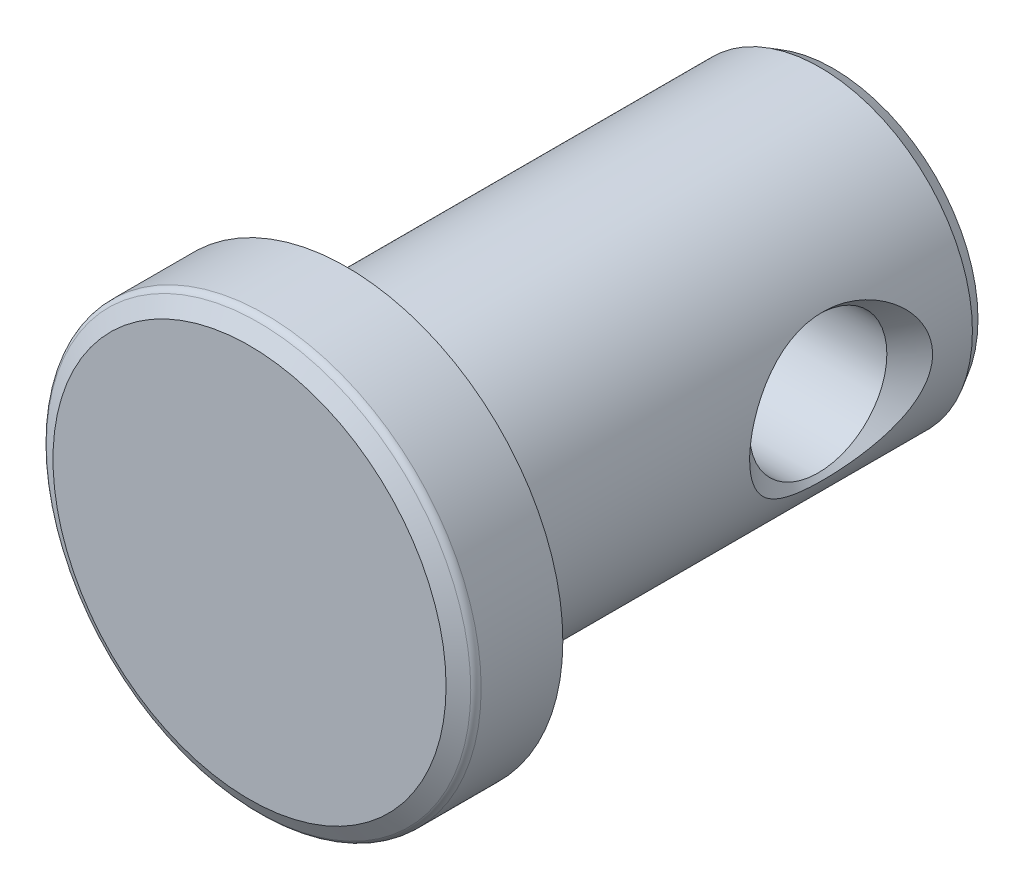
ISO-10303-21;
HEADER;
FILE_DESCRIPTION(('STEP AP214'),'2;1');
FILE_NAME('part.step','',(''),(''),'','','');
FILE_SCHEMA(('AUTOMOTIVE_DESIGN { 1 0 10303 214 1 1 1 1 }'));
ENDSEC;
DATA;
#1=APPLICATION_CONTEXT('core data for automotive mechanical design processes');
#2=APPLICATION_PROTOCOL_DEFINITION('international standard','automotive_design',2000,#1);
#3=PRODUCT_CONTEXT('',#1,'mechanical');
#4=PRODUCT('Part','Part','',(#3));
#5=PRODUCT_RELATED_PRODUCT_CATEGORY('part','',(#4));
#6=PRODUCT_DEFINITION_FORMATION('','',#4);
#7=PRODUCT_DEFINITION_CONTEXT('part definition',#1,'design');
#8=PRODUCT_DEFINITION('design','',#6,#7);
#9=PRODUCT_DEFINITION_SHAPE('','',#8);
#10=(LENGTH_UNIT() NAMED_UNIT(*) SI_UNIT(.MILLI.,.METRE.));
#11=(NAMED_UNIT(*) PLANE_ANGLE_UNIT() SI_UNIT($,.RADIAN.));
#12=(NAMED_UNIT(*) SI_UNIT($,.STERADIAN.) SOLID_ANGLE_UNIT());
#13=UNCERTAINTY_MEASURE_WITH_UNIT(LENGTH_MEASURE(1.E-05),#10,'distance_accuracy_value','');
#14=(GEOMETRIC_REPRESENTATION_CONTEXT(3) GLOBAL_UNCERTAINTY_ASSIGNED_CONTEXT((#13)) GLOBAL_UNIT_ASSIGNED_CONTEXT((#10,
#11,#12)) REPRESENTATION_CONTEXT('',''));
#15=CARTESIAN_POINT('',(0.,0.,0.));
#16=DIRECTION('',(0.,0.,1.));
#17=DIRECTION('',(1.,0.,0.));
#18=AXIS2_PLACEMENT_3D('',#15,#16,#17);
#19=CARTESIAN_POINT('',(0.,0.,6.35));
#20=DIRECTION('',(0.,0.,1.));
#21=DIRECTION('',(1.,0.,0.));
#22=AXIS2_PLACEMENT_3D('',#19,#20,#21);
#23=CYLINDRICAL_SURFACE('',#22,3.9751);
#24=CARTESIAN_POINT('',(-3.82643748007835,-1.07694058647979,-4.54101522611289));
#25=CARTESIAN_POINT('',(-3.80340961947426,-1.15876229377878,-4.46985763651813));
#26=CARTESIAN_POINT('',(-3.77924982220282,-1.23455494734904,-4.39214167255414));
#27=CARTESIAN_POINT('',(-3.73083058634614,-1.37396423330214,-4.2265068648053));
#28=CARTESIAN_POINT('',(-3.70657107264391,-1.43756870113621,-4.13857796698778));
#29=CARTESIAN_POINT('',(-3.65611377151084,-1.56187327261285,-3.94000708346451));
#30=CARTESIAN_POINT('',(-3.63022464718491,-1.6204894192179,-3.82797989187618));
#31=CARTESIAN_POINT('',(-3.58344381554274,-1.72146619822226,-3.59585667697558));
#32=CARTESIAN_POINT('',(-3.56255386847473,-1.76382110807973,-3.47575783058139));
#33=CARTESIAN_POINT('',(-3.52545249984078,-1.83699610693502,-3.21212639610093));
#34=CARTESIAN_POINT('',(-3.51035398229165,-1.86526354719489,-3.067716031371));
#35=CARTESIAN_POINT('',(-3.49182350781219,-1.89973186224367,-2.77557720375863));
#36=CARTESIAN_POINT('',(-3.48838915937021,-1.90593726043862,-2.62784942730033));
#37=CARTESIAN_POINT('',(-3.49369191069717,-1.89619688184882,-2.33433224729264));
#38=CARTESIAN_POINT('',(-3.50234862535577,-1.88039740224467,-2.18853648574035));
#39=CARTESIAN_POINT('',(-3.53038747985248,-1.82720328940694,-1.90191259663654));
#40=CARTESIAN_POINT('',(-3.54977790043675,-1.78979198229619,-1.76108839383946));
#41=CARTESIAN_POINT('',(-3.59669944051289,-1.69353138139375,-1.48747125278432));
#42=CARTESIAN_POINT('',(-3.62427772747663,-1.63455740380095,-1.35473037125108));
#43=CARTESIAN_POINT('',(-3.68390978716511,-1.49531085275908,-1.10199491184463));
#44=CARTESIAN_POINT('',(-3.71596018907952,-1.41505428019492,-0.981990852568222));
#45=CARTESIAN_POINT('',(-3.77233140052246,-1.25547689567154,-0.786890652837697));
#46=CARTESIAN_POINT('',(-3.79661697013559,-1.18076905357289,-0.708004340496707));
#47=CARTESIAN_POINT('',(-3.8431294909839,-1.01922052225169,-0.563095025191479));
#48=CARTESIAN_POINT('',(-3.86535983047798,-0.932400416567153,-0.497050645198684));
#49=CARTESIAN_POINT('',(-3.90131029308091,-0.766093451593039,-0.393118408672082));
#50=CARTESIAN_POINT('',(-3.91584251594878,-0.688660562085003,-0.352238203404533));
#51=CARTESIAN_POINT('',(-3.94075962661656,-0.527679374496886,-0.283130479101266));
#52=CARTESIAN_POINT('',(-3.95114741884406,-0.444135407834027,-0.254894097537709));
#53=CARTESIAN_POINT('',(-3.96670094592032,-0.272354268328005,-0.212888961585174));
#54=CARTESIAN_POINT('',(-3.97183134469941,-0.184089480007816,-0.199218081009173));
#55=CARTESIAN_POINT('',(-3.97608633148908,-0.00639586015051778,-0.187866855724356));
#56=CARTESIAN_POINT('',(-3.97521329979005,0.0830324960097191,-0.190180173468535));
#57=CARTESIAN_POINT('',(-3.96800286001554,0.250256652605567,-0.209456839335923));
#58=CARTESIAN_POINT('',(-3.96226187383386,0.328270954369364,-0.224821490487522));
#59=CARTESIAN_POINT('',(-3.94667715793361,0.4806563809819,-0.26706555649697));
#60=CARTESIAN_POINT('',(-3.93683274527504,0.555026897085799,-0.293946888115548));
#61=CARTESIAN_POINT('',(-3.91327764465712,0.702535242968325,-0.35945265842862));
#62=CARTESIAN_POINT('',(-3.89938994104233,0.775399620719499,-0.39862320346026));
#63=CARTESIAN_POINT('',(-3.86909322225121,0.914674163840125,-0.486307876107147));
#64=CARTESIAN_POINT('',(-3.85268233627979,0.981079480049124,-0.534828943418643));
#65=CARTESIAN_POINT('',(-3.80968402924804,1.13904414823776,-0.666224514279943));
#66=CARTESIAN_POINT('',(-3.78215967310927,1.22626000569189,-0.754034344225825));
#67=CARTESIAN_POINT('',(-3.72699391232398,1.38492603821817,-0.942889013720701));
#68=CARTESIAN_POINT('',(-3.69935238621976,1.45634759767613,-1.04395735547205));
#69=CARTESIAN_POINT('',(-3.64631401314617,1.5845184514708,-1.25784338731287));
#70=CARTESIAN_POINT('',(-3.62096067173673,1.64101191978833,-1.37082458867957));
#71=CARTESIAN_POINT('',(-3.57554046887568,1.73775285056882,-1.60445357637367));
#72=CARTESIAN_POINT('',(-3.55547175436556,1.77800601035027,-1.72509865688767));
#73=CARTESIAN_POINT('',(-3.5202472467638,1.84689659854725,-1.99025493558214));
#74=CARTESIAN_POINT('',(-3.50628344322534,1.87287837600224,-2.13562757490295));
#75=CARTESIAN_POINT('',(-3.49023678890882,1.90261956217379,-2.42927537313586));
#76=CARTESIAN_POINT('',(-3.48815382245512,1.90637918725235,-2.57755050377427));
#77=CARTESIAN_POINT('',(-3.49614396821527,1.89168144847368,-2.87103181037196));
#78=CARTESIAN_POINT('',(-3.50608504287703,1.87346540790825,-3.01625382423986));
#79=CARTESIAN_POINT('',(-3.53641936121992,1.81554689362808,-3.30131545716483));
#80=CARTESIAN_POINT('',(-3.55682100653891,1.77582714730289,-3.44115065247029));
#81=CARTESIAN_POINT('',(-3.60546884322506,1.67486615890086,-3.71284772091401));
#82=CARTESIAN_POINT('',(-3.63378469265293,1.61343246573858,-3.84462551033357));
#83=CARTESIAN_POINT('',(-3.6944615504342,1.46917796358799,-4.09491193423229));
#84=CARTESIAN_POINT('',(-3.72681879870057,1.38637695922043,-4.21343271113145));
#85=CARTESIAN_POINT('',(-3.78276020391457,1.22371455640988,-4.4035960703516));
#86=CARTESIAN_POINT('',(-3.80642837700849,1.14873410986262,-4.47939723846152));
#87=CARTESIAN_POINT('',(-3.85149023928349,0.987141025034064,-4.61819805207427));
#88=CARTESIAN_POINT('',(-3.87288767007469,0.900548071587092,-4.68121891747546));
#89=CARTESIAN_POINT('',(-3.9073735740855,0.734551844113735,-4.78024534129163));
#90=CARTESIAN_POINT('',(-3.92126865942386,0.657037192891857,-4.81912232439663));
#91=CARTESIAN_POINT('',(-3.94483977324634,0.496226954330582,-4.88421745292665));
#92=CARTESIAN_POINT('',(-3.9545187241145,0.412935417768241,-4.91044436801469));
#93=CARTESIAN_POINT('',(-3.96865077049351,0.242095361545105,-4.9485259265936));
#94=CARTESIAN_POINT('',(-3.97307117704795,0.154523700640545,-4.96029068314645));
#95=CARTESIAN_POINT('',(-3.97601444073262,-0.0214151421057132,-4.96813894274884));
#96=CARTESIAN_POINT('',(-3.97453915166233,-0.109782065172633,-4.96422737494629));
#97=CARTESIAN_POINT('',(-3.96632677463884,-0.275444037937247,-4.9422518395939));
#98=CARTESIAN_POINT('',(-3.9601281273731,-0.352965548905855,-4.92563552989368));
#99=CARTESIAN_POINT('',(-3.94372702321409,-0.504212263444769,-4.88108242354218));
#100=CARTESIAN_POINT('',(-3.93352353023946,-0.577936479040682,-4.85314269738358));
#101=CARTESIAN_POINT('',(-3.90883352518545,-0.727117191703546,-4.78425277840521));
#102=CARTESIAN_POINT('',(-3.89402948647434,-0.802058445299214,-4.74230978279803));
#103=CARTESIAN_POINT('',(-3.86186275164993,-0.944886215995423,-4.64859895133175));
#104=CARTESIAN_POINT('',(-3.84449825905446,-1.01276772229663,-4.59682420985824));
#105=CARTESIAN_POINT('',(-3.82643748007835,-1.07694058647979,-4.54101522611289));
#106=B_SPLINE_CURVE_WITH_KNOTS('',3,(#24,#25,#26,#27,#28,#29,#30,#31,#32,#33,#34,#35,#36,#37,
#38,#39,#40,#41,#42,#43,#44,#45,#46,#47,#48,#49,#50,#51,#52,#53,#54,#55,#56,#57,#58,#59,#60,#61,
#62,#63,#64,#65,#66,#67,#68,#69,#70,#71,#72,#73,#74,#75,#76,#77,#78,#79,#80,#81,#82,#83,#84,#85,
#86,#87,#88,#89,#90,#91,#92,#93,#94,#95,#96,#97,#98,#99,#100,#101,#102,#103,#104,#105),
.UNSPECIFIED.,.T.,.F.,(4,2,2,2,2,2,2,2,2,2,2,2,2,2,2,2,2,2,2,2,2,2,2,2,2,2,2,2,2,2,2,2,2,2,2,2,
2,2,2,2,4),(0.,0.332288609355063,0.664907155001696,1.05061559531827,1.43645964733271,
1.87808227832972,2.31961435770361,2.75822492820166,3.19717434670393,3.6387031554409,
4.07990094628751,4.41272029859722,4.74498079660189,5.01021244094966,5.27525788240613,
5.54207329335618,5.80878292119986,6.04687258425486,6.28500188879432,6.53573147043712,
6.78664785825178,7.1649403169657,7.54391263886069,7.92901073331096,8.31397361245758,
8.75680426906086,9.19963061411564,9.6376380583614,10.0759978502983,10.5183444963066,
10.960282609976,11.28679041272,11.61275157465,11.8751759058495,12.1374180488944,
12.4012820016402,12.6650629934597,12.9025841984267,13.1401668923219,13.4005976489773,
13.6612120079497),.UNSPECIFIED.);
#107=CARTESIAN_POINT('',(-3.82643748007835,-1.07694058647979,-4.54101522611289));
#108=VERTEX_POINT('',#107);
#109=EDGE_CURVE('E63',#108,#108,#106,.T.);
#110=ORIENTED_EDGE('',*,*,#109,.F.);
#111=EDGE_LOOP('',(#110));
#112=FACE_BOUND('',#111,.T.);
#113=CARTESIAN_POINT('',(0.,0.,6.151245));
#114=DIRECTION('',(0.,0.,1.));
#115=DIRECTION('',(1.,0.,0.));
#116=AXIS2_PLACEMENT_3D('',#113,#114,#115);
#117=CIRCLE('',#116,3.9751);
#118=CARTESIAN_POINT('',(3.9751,0.,6.151245));
#119=VERTEX_POINT('',#118);
#120=EDGE_CURVE('E10',#119,#119,#117,.F.);
#121=ORIENTED_EDGE('',*,*,#120,.T.);
#122=EDGE_LOOP('',(#121));
#123=FACE_BOUND('',#122,.T.);
#124=CARTESIAN_POINT('',(0.,0.,-6.00574624174165));
#125=DIRECTION('',(0.,0.,1.));
#126=DIRECTION('',(1.,0.,0.));
#127=AXIS2_PLACEMENT_3D('',#124,#125,#126);
#128=CIRCLE('',#127,3.9751);
#129=CARTESIAN_POINT('',(3.9751,0.,-6.00574624174165));
#130=VERTEX_POINT('',#129);
#131=EDGE_CURVE('E133',#130,#130,#128,.T.);
#132=ORIENTED_EDGE('',*,*,#131,.T.);
#133=EDGE_LOOP('',(#132));
#134=FACE_BOUND('',#133,.T.);
#135=CARTESIAN_POINT('',(3.82643748007835,-1.07694058647979,-4.54101522611289));
#136=CARTESIAN_POINT('',(3.84966792311604,-0.99440229208386,-4.61279693939063));
#137=CARTESIAN_POINT('',(3.87176292481149,-0.905679227861297,-4.6779548800937));
#138=CARTESIAN_POINT('',(3.91110686969781,-0.716855249500103,-4.79099901345332));
#139=CARTESIAN_POINT('',(3.92836579770212,-0.616778386632106,-4.83892085160481));
#140=CARTESIAN_POINT('',(3.95178079698464,-0.436687927586181,-4.90307403078027));
#141=CARTESIAN_POINT('',(3.95968408792754,-0.358706711078792,-4.92439332559249));
#142=CARTESIAN_POINT('',(3.97085747517787,-0.200033469722788,-4.95441029871307));
#143=CARTESIAN_POINT('',(3.97413121173905,-0.11934362585873,-4.96311789382712));
#144=CARTESIAN_POINT('',(3.97569800256795,0.0425613000951286,-4.96729392835765));
#145=CARTESIAN_POINT('',(3.9739828685157,0.123777027136292,-4.96274060237877));
#146=CARTESIAN_POINT('',(3.96574346165495,0.284176216900789,-4.94068923783323));
#147=CARTESIAN_POINT('',(3.95921762349804,0.363359009449831,-4.92318698582654));
#148=CARTESIAN_POINT('',(3.94212553444231,0.516673387978603,-4.8767037337254));
#149=CARTESIAN_POINT('',(3.93161066093703,0.590855633896852,-4.84786853477699));
#150=CARTESIAN_POINT('',(3.90742849736417,0.733963270181326,-4.78025679480489));
#151=CARTESIAN_POINT('',(3.89375935191725,0.802885534688285,-4.74147440122309));
#152=CARTESIAN_POINT('',(3.85775492734112,0.963631009212244,-4.63669714796614));
#153=CARTESIAN_POINT('',(3.83424501977873,1.05227617743545,-4.56622093548527));
#154=CARTESIAN_POINT('',(3.78536456110421,1.21647457635251,-4.41193203004635));
#155=CARTESIAN_POINT('',(3.75999088680149,1.29200508360222,-4.32809666249079));
#156=CARTESIAN_POINT('',(3.70929316207401,1.43113234005928,-4.14855534964358));
#157=CARTESIAN_POINT('',(3.68397814432446,1.49449105387407,-4.05266364918946));
#158=CARTESIAN_POINT('',(3.63601824724863,1.60765866327857,-3.85265661323267));
#159=CARTESIAN_POINT('',(3.61337313044373,1.65746876448729,-3.74854201050693));
#160=CARTESIAN_POINT('',(3.56816700612962,1.75299733105398,-3.51044085633461));
#161=CARTESIAN_POINT('',(3.54671198252009,1.79542694873316,-3.37490811992171));
#162=CARTESIAN_POINT('',(3.513394081947,1.8597860959744,-3.09790371565666));
#163=CARTESIAN_POINT('',(3.50153316797288,1.88171143042932,-2.95643083865575));
#164=CARTESIAN_POINT('',(3.48889348731604,1.90505719211959,-2.66655023079077));
#165=CARTESIAN_POINT('',(3.48849448263482,1.90577498153622,-2.51806794471271));
#166=CARTESIAN_POINT('',(3.49981980698862,1.88489031949944,-2.22313512097934));
#167=CARTESIAN_POINT('',(3.51154689086273,1.86328279611918,-2.07668505267065));
#168=CARTESIAN_POINT('',(3.54508825050516,1.79862672403138,-1.79207043318239));
#169=CARTESIAN_POINT('',(3.5667561076003,1.75588872167393,-1.65381743568775));
#170=CARTESIAN_POINT('',(3.61719598833598,1.64947650402412,-1.38691935452522));
#171=CARTESIAN_POINT('',(3.64596934612587,1.58579835620397,-1.25827608112202));
#172=CARTESIAN_POINT('',(3.70263423314711,1.44798382463688,-1.03165287272444));
#173=CARTESIAN_POINT('',(3.73008247742864,1.37657065136719,-0.931903572528899));
#174=CARTESIAN_POINT('',(3.78476459438619,1.21818436444045,-0.745572648906542));
#175=CARTESIAN_POINT('',(3.81199874181534,1.13123658320537,-0.658970006137853));
#176=CARTESIAN_POINT('',(3.85706477563672,0.9643982470532,-0.521588800993405));
#177=CARTESIAN_POINT('',(3.87559781810622,0.887694113522051,-0.467180562123118));
#178=CARTESIAN_POINT('',(3.90911514316354,0.725973813424707,-0.370972491846265));
#179=CARTESIAN_POINT('',(3.92410162427104,0.64096284271073,-0.32916484488912));
#180=CARTESIAN_POINT('',(3.94903226449832,0.463321167170744,-0.260524506467626));
#181=CARTESIAN_POINT('',(3.95892617709467,0.370624632558129,-0.233840786479761));
#182=CARTESIAN_POINT('',(3.97208493011195,0.181410667006507,-0.198494402877559));
#183=CARTESIAN_POINT('',(3.97535747034346,0.0848978073370287,-0.189810807128779));
#184=CARTESIAN_POINT('',(3.97485066657185,-0.0933361990769903,-0.191167047524396));
#185=CARTESIAN_POINT('',(3.97206064180393,-0.175092428659985,-0.198580024884294));
#186=CARTESIAN_POINT('',(3.96169208608739,-0.336031522745038,-0.226396049783184));
#187=CARTESIAN_POINT('',(3.95411314756973,-0.41521416761444,-0.246800202960458));
#188=CARTESIAN_POINT('',(3.93505153396014,-0.568026058534567,-0.298913029917217));
#189=CARTESIAN_POINT('',(3.92362144096272,-0.641714586334988,-0.330469701603308));
#190=CARTESIAN_POINT('',(3.89778372354388,-0.783522693643917,-0.403312446244958));
#191=CARTESIAN_POINT('',(3.88337437302623,-0.851639012702237,-0.444604161359247));
#192=CARTESIAN_POINT('',(3.84542580141675,-1.01176744224294,-0.556345831737027));
#193=CARTESIAN_POINT('',(3.8207453755669,-1.10026914093284,-0.631450831591305));
#194=CARTESIAN_POINT('',(3.76993727563568,-1.26346033452261,-0.794998992018738));
#195=CARTESIAN_POINT('',(3.74380710243741,-1.33812495068993,-0.883465668213834));
#196=CARTESIAN_POINT('',(3.69211718075989,-1.47482930078812,-1.07230190294325));
#197=CARTESIAN_POINT('',(3.66657590810428,-1.53662021548904,-1.17285555467236));
#198=CARTESIAN_POINT('',(3.61881501109556,-1.64595094552866,-1.38208430610331));
#199=CARTESIAN_POINT('',(3.59659490653518,-1.69349282213511,-1.49075822828144));
#200=CARTESIAN_POINT('',(3.55346589023506,-1.78248224290073,-1.73690415796679));
#201=CARTESIAN_POINT('',(3.53373428171762,-1.82074463772932,-1.87575054734208));
#202=CARTESIAN_POINT('',(3.50462788114469,-1.87616462620741,-2.15865219210237));
#203=CARTESIAN_POINT('',(3.49525376919499,-1.89332083396667,-2.30270778889901));
#204=CARTESIAN_POINT('',(3.48818761772552,-1.90631425940913,-2.59463913526066));
#205=CARTESIAN_POINT('',(3.49070488011025,-1.9017694999882,-2.74253741359349));
#206=CARTESIAN_POINT('',(3.50752040109506,-1.87056703528968,-3.03537686961425));
#207=CARTESIAN_POINT('',(3.52182639000917,-1.84389482012459,-3.18031604297848));
#208=CARTESIAN_POINT('',(3.55992817851203,-1.76919702351371,-3.46191875215952));
#209=CARTESIAN_POINT('',(3.58364403451047,-1.72135094406691,-3.59864110708028));
#210=CARTESIAN_POINT('',(3.63737140473296,-1.60470018102084,-3.86138720138379));
#211=CARTESIAN_POINT('',(3.66737456070273,-1.53592326824118,-3.98742483554681));
#212=CARTESIAN_POINT('',(3.71969695331867,-1.40306088383026,-4.18638026085495));
#213=CARTESIAN_POINT('',(3.74136353993957,-1.34465029836385,-4.26329583367242));
#214=CARTESIAN_POINT('',(3.78446198107245,-1.21808852354618,-4.40887521863913));
#215=CARTESIAN_POINT('',(3.80589372682619,-1.14993301073846,-4.47753534313337));
#216=CARTESIAN_POINT('',(3.82643748007835,-1.07694058647979,-4.54101522611289));
#217=B_SPLINE_CURVE_WITH_KNOTS('',3,(#135,#136,#137,#138,#139,#140,#141,#142,#143,#144,#145,
#146,#147,#148,#149,#150,#151,#152,#153,#154,#155,#156,#157,#158,#159,#160,#161,#162,#163,#164,
#165,#166,#167,#168,#169,#170,#171,#172,#173,#174,#175,#176,#177,#178,#179,#180,#181,#182,#183,
#184,#185,#186,#187,#188,#189,#190,#191,#192,#193,#194,#195,#196,#197,#198,#199,#200,#201,#202,
#203,#204,#205,#206,#207,#208,#209,#210,#211,#212,#213,#214,#215,#216),.UNSPECIFIED.,.T.,.F.,(4,
2,2,2,2,2,2,2,2,2,2,2,2,2,2,2,2,2,2,2,2,2,2,2,2,2,2,2,2,2,2,2,2,2,2,2,2,2,2,2,4),(0.,
0.33512998157224,0.669562850236183,0.912204159421967,1.15465457161719,1.39750314631447,
1.64043077607605,1.88033033093013,2.12037135881437,2.4654627560006,2.81114624372172,
3.16302267026366,3.51486777494197,3.9438190526113,4.3728580730761,4.81609640480425,
5.25943545479881,5.69644438014024,6.1335354220136,6.50926442941615,6.88438623337917,
7.17087688806506,7.45718947873018,7.74627532439812,8.03502480648366,8.28021588089925,
8.52542782554905,8.76741897503006,9.00955072209031,9.36361705532656,9.71831394244854,
10.0793346350111,10.4403030770375,10.8743894551555,11.308504335057,11.7502883198393,
12.1923622298391,12.6307581725875,13.0685749732924,13.3648140475727,13.6611849621373),.UNSPECIFIED.);
#218=CARTESIAN_POINT('',(3.82643748007835,-1.07694058647979,-4.54101522611289));
#219=VERTEX_POINT('',#218);
#220=EDGE_CURVE('E75',#219,#219,#217,.T.);
#221=ORIENTED_EDGE('',*,*,#220,.F.);
#222=EDGE_LOOP('',(#221));
#223=FACE_BOUND('',#222,.T.);
#224=ADVANCED_FACE('F41',(#112,#123,#134,#223),#23,.T.);
#225=CARTESIAN_POINT('',(0.,0.,-6.35));
#226=DIRECTION('',(0.,0.,1.));
#227=DIRECTION('',(1.,0.,0.));
#228=AXIS2_PLACEMENT_3D('',#225,#226,#227);
#229=CONICAL_SURFACE('',#228,3.776345,0.523598775598301);
#230=ORIENTED_EDGE('',*,*,#131,.F.);
#231=EDGE_LOOP('',(#230));
#232=FACE_BOUND('',#231,.T.);
#233=CARTESIAN_POINT('',(0.,0.,-6.35));
#234=DIRECTION('',(0.,0.,1.));
#235=DIRECTION('',(1.,0.,0.));
#236=AXIS2_PLACEMENT_3D('',#233,#234,#235);
#237=CIRCLE('',#236,3.776345);
#238=CARTESIAN_POINT('',(3.776345,0.,-6.35));
#239=VERTEX_POINT('',#238);
#240=EDGE_CURVE('E138',#239,#239,#237,.T.);
#241=ORIENTED_EDGE('',*,*,#240,.T.);
#242=EDGE_LOOP('',(#241));
#243=FACE_BOUND('',#242,.T.);
#244=ADVANCED_FACE('F118',(#232,#243),#229,.T.);
#245=CARTESIAN_POINT('',(0.,5.6388,6.35));
#246=DIRECTION('',(0.,0.,1.));
#247=DIRECTION('',(1.,0.,0.));
#248=AXIS2_PLACEMENT_3D('',#245,#246,#247);
#249=PLANE('',#248);
#250=CARTESIAN_POINT('',(0.,0.,6.35));
#251=DIRECTION('',(0.,0.,1.));
#252=DIRECTION('',(1.,0.,0.));
#253=AXIS2_PLACEMENT_3D('',#250,#251,#252);
#254=CIRCLE('',#253,4.173855);
#255=CARTESIAN_POINT('',(4.173855,0.,6.35));
#256=VERTEX_POINT('',#255);
#257=EDGE_CURVE('E50',#256,#256,#254,.T.);
#258=ORIENTED_EDGE('',*,*,#257,.T.);
#259=EDGE_LOOP('',(#258));
#260=FACE_BOUND('',#259,.T.);
#261=CARTESIAN_POINT('',(0.,0.,6.35));
#262=DIRECTION('',(0.,0.,1.));
#263=DIRECTION('',(1.,0.,0.));
#264=AXIS2_PLACEMENT_3D('',#261,#262,#263);
#265=CIRCLE('',#264,5.6388);
#266=CARTESIAN_POINT('',(5.6388,0.,6.35));
#267=VERTEX_POINT('',#266);
#268=EDGE_CURVE('E148',#267,#267,#265,.T.);
#269=ORIENTED_EDGE('',*,*,#268,.F.);
#270=EDGE_LOOP('',(#269));
#271=FACE_BOUND('',#270,.T.);
#272=ADVANCED_FACE('F115',(#260,#271),#249,.F.);
#273=CARTESIAN_POINT('',(0.,0.,6.35));
#274=DIRECTION('',(0.,0.,1.));
#275=DIRECTION('',(1.,0.,0.));
#276=AXIS2_PLACEMENT_3D('',#273,#274,#275);
#277=CYLINDRICAL_SURFACE('',#276,5.6388);
#278=CARTESIAN_POINT('',(0.,0.,8.48195481049889));
#279=DIRECTION('',(0.,0.,-1.));
#280=DIRECTION('',(-1.,0.,0.));
#281=AXIS2_PLACEMENT_3D('',#278,#279,#280);
#282=CIRCLE('',#281,5.6388);
#283=CARTESIAN_POINT('',(-5.6388,0.,8.48195481049889));
#284=VERTEX_POINT('',#283);
#285=EDGE_CURVE('E57',#284,#284,#282,.T.);
#286=ORIENTED_EDGE('',*,*,#285,.T.);
#287=EDGE_LOOP('',(#286));
#288=FACE_BOUND('',#287,.T.);
#289=ORIENTED_EDGE('',*,*,#268,.T.);
#290=EDGE_LOOP('',(#289));
#291=FACE_BOUND('',#290,.T.);
#292=ADVANCED_FACE('F112',(#288,#291),#277,.T.);
#293=CARTESIAN_POINT('',(0.,0.,8.59670606325167));
#294=DIRECTION('',(0.,0.,-1.));
#295=DIRECTION('',(-1.,0.,0.));
#296=AXIS2_PLACEMENT_3D('',#293,#294,#295);
#297=CONICAL_SURFACE('',#296,5.6388,1.0471975511966);
#298=CARTESIAN_POINT('',(0.,0.,8.65408168962806));
#299=DIRECTION('',(0.,0.,1.));
#300=DIRECTION('',(1.,0.,0.));
#301=AXIS2_PLACEMENT_3D('',#298,#299,#300);
#302=CIRCLE('',#301,5.5394225);
#303=CARTESIAN_POINT('',(5.5394225,0.,8.65408168962806));
#304=VERTEX_POINT('',#303);
#305=EDGE_CURVE('E156',#304,#304,#302,.T.);
#306=ORIENTED_EDGE('',*,*,#305,.T.);
#307=EDGE_LOOP('',(#306));
#308=FACE_BOUND('',#307,.T.);
#309=CARTESIAN_POINT('',(0.,0.,8.89));
#310=DIRECTION('',(0.,0.,1.));
#311=DIRECTION('',(1.,0.,0.));
#312=AXIS2_PLACEMENT_3D('',#309,#310,#311);
#313=CIRCLE('',#312,5.1308);
#314=CARTESIAN_POINT('',(5.1308,0.,8.89));
#315=VERTEX_POINT('',#314);
#316=EDGE_CURVE('E142',#315,#315,#313,.T.);
#317=ORIENTED_EDGE('',*,*,#316,.F.);
#318=EDGE_LOOP('',(#317));
#319=FACE_BOUND('',#318,.T.);
#320=ADVANCED_FACE('F108',(#308,#319),#297,.T.);
#321=CARTESIAN_POINT('',(0.,0.,8.89));
#322=DIRECTION('',(0.,0.,-1.));
#323=DIRECTION('',(-1.,0.,0.));
#324=AXIS2_PLACEMENT_3D('',#321,#322,#323);
#325=PLANE('',#324);
#326=ORIENTED_EDGE('',*,*,#316,.T.);
#327=EDGE_LOOP('',(#326));
#328=FACE_BOUND('',#327,.T.);
#329=ADVANCED_FACE('F104',(#328),#325,.F.);
#330=CARTESIAN_POINT('',(0.,3.776345,-6.35));
#331=DIRECTION('',(0.,0.,1.));
#332=DIRECTION('',(1.,0.,0.));
#333=AXIS2_PLACEMENT_3D('',#330,#331,#332);
#334=PLANE('',#333);
#335=ORIENTED_EDGE('',*,*,#240,.F.);
#336=EDGE_LOOP('',(#335));
#337=FACE_BOUND('',#336,.T.);
#338=ADVANCED_FACE('F100',(#337),#334,.F.);
#339=CARTESIAN_POINT('',(0.,0.,8.48195481049889));
#340=DIRECTION('',(0.,0.,-1.));
#341=DIRECTION('',(-1.,0.,0.));
#342=AXIS2_PLACEMENT_3D('',#339,#340,#341);
#343=TOROIDAL_SURFACE('',#342,5.440045,0.198755);
#344=ORIENTED_EDGE('',*,*,#285,.F.);
#345=EDGE_LOOP('',(#344));
#346=FACE_BOUND('',#345,.T.);
#347=ORIENTED_EDGE('',*,*,#305,.F.);
#348=EDGE_LOOP('',(#347));
#349=FACE_BOUND('',#348,.T.);
#350=ADVANCED_FACE('F103',(#346,#349),#343,.T.);
#351=CARTESIAN_POINT('',(0.,0.,6.151245));
#352=DIRECTION('',(0.,0.,1.));
#353=DIRECTION('',(1.,0.,0.));
#354=AXIS2_PLACEMENT_3D('',#351,#352,#353);
#355=TOROIDAL_SURFACE('',#354,4.173855,0.198755);
#356=ORIENTED_EDGE('',*,*,#120,.F.);
#357=EDGE_LOOP('',(#356));
#358=FACE_BOUND('',#357,.T.);
#359=ORIENTED_EDGE('',*,*,#257,.F.);
#360=EDGE_LOOP('',(#359));
#361=FACE_BOUND('',#360,.T.);
#362=ADVANCED_FACE('F43',(#358,#361),#355,.F.);
#363=CARTESIAN_POINT('',(-3.9751,0.,-2.5781));
#364=DIRECTION('',(-1.,0.,0.));
#365=DIRECTION('',(0.,0.,1.));
#366=AXIS2_PLACEMENT_3D('',#363,#364,#365);
#367=CONICAL_SURFACE('',#366,2.3876,0.78539816339745);
#368=CARTESIAN_POINT('',(-3.3782,0.,-2.5781));
#369=DIRECTION('',(-1.,0.,0.));
#370=DIRECTION('',(0.,0.,1.));
#371=AXIS2_PLACEMENT_3D('',#368,#369,#370);
#372=CIRCLE('',#371,1.7907);
#373=CARTESIAN_POINT('',(-3.3782,0.,-0.787399999999997));
#374=VERTEX_POINT('',#373);
#375=EDGE_CURVE('E60',#374,#374,#372,.F.);
#376=ORIENTED_EDGE('',*,*,#375,.T.);
#377=EDGE_LOOP('',(#376));
#378=FACE_BOUND('',#377,.T.);
#379=ORIENTED_EDGE('',*,*,#109,.T.);
#380=EDGE_LOOP('',(#379));
#381=FACE_BOUND('',#380,.T.);
#382=ADVANCED_FACE('F90',(#378,#381),#367,.F.);
#383=CARTESIAN_POINT('',(1.58750000000001,0.,-2.5781));
#384=DIRECTION('',(1.,0.,0.));
#385=DIRECTION('',(0.,0.,-1.));
#386=AXIS2_PLACEMENT_3D('',#383,#384,#385);
#387=CONICAL_SURFACE('',#386,0.,0.78539816339745);
#388=CARTESIAN_POINT('',(3.3782,0.,-2.5781));
#389=DIRECTION('',(1.,0.,0.));
#390=DIRECTION('',(0.,0.,-1.));
#391=AXIS2_PLACEMENT_3D('',#388,#389,#390);
#392=CIRCLE('',#391,1.7907);
#393=CARTESIAN_POINT('',(3.3782,0.,-4.3688));
#394=VERTEX_POINT('',#393);
#395=EDGE_CURVE('E45',#394,#394,#392,.F.);
#396=ORIENTED_EDGE('',*,*,#395,.T.);
#397=EDGE_LOOP('',(#396));
#398=FACE_BOUND('',#397,.T.);
#399=ORIENTED_EDGE('',*,*,#220,.T.);
#400=EDGE_LOOP('',(#399));
#401=FACE_BOUND('',#400,.T.);
#402=ADVANCED_FACE('F94',(#398,#401),#387,.F.);
#403=CARTESIAN_POINT('',(-5.6388,0.,-2.5781));
#404=DIRECTION('',(1.,0.,0.));
#405=DIRECTION('',(0.,0.,-1.));
#406=AXIS2_PLACEMENT_3D('',#403,#404,#405);
#407=CYLINDRICAL_SURFACE('',#406,1.7907);
#408=ORIENTED_EDGE('',*,*,#375,.F.);
#409=EDGE_LOOP('',(#408));
#410=FACE_BOUND('',#409,.T.);
#411=ORIENTED_EDGE('',*,*,#395,.F.);
#412=EDGE_LOOP('',(#411));
#413=FACE_BOUND('',#412,.T.);
#414=ADVANCED_FACE('F96',(#410,#413),#407,.F.);
#415=CLOSED_SHELL('',(#224,#244,#272,#292,#320,#329,#338,#350,#362,#382,#402,#414));
#416=MANIFOLD_SOLID_BREP('B2',#415);
#417=ADVANCED_BREP_SHAPE_REPRESENTATION('',(#18,#416),#14);
#418=SHAPE_DEFINITION_REPRESENTATION(#9,#417);
ENDSEC;
END-ISO-10303-21;
